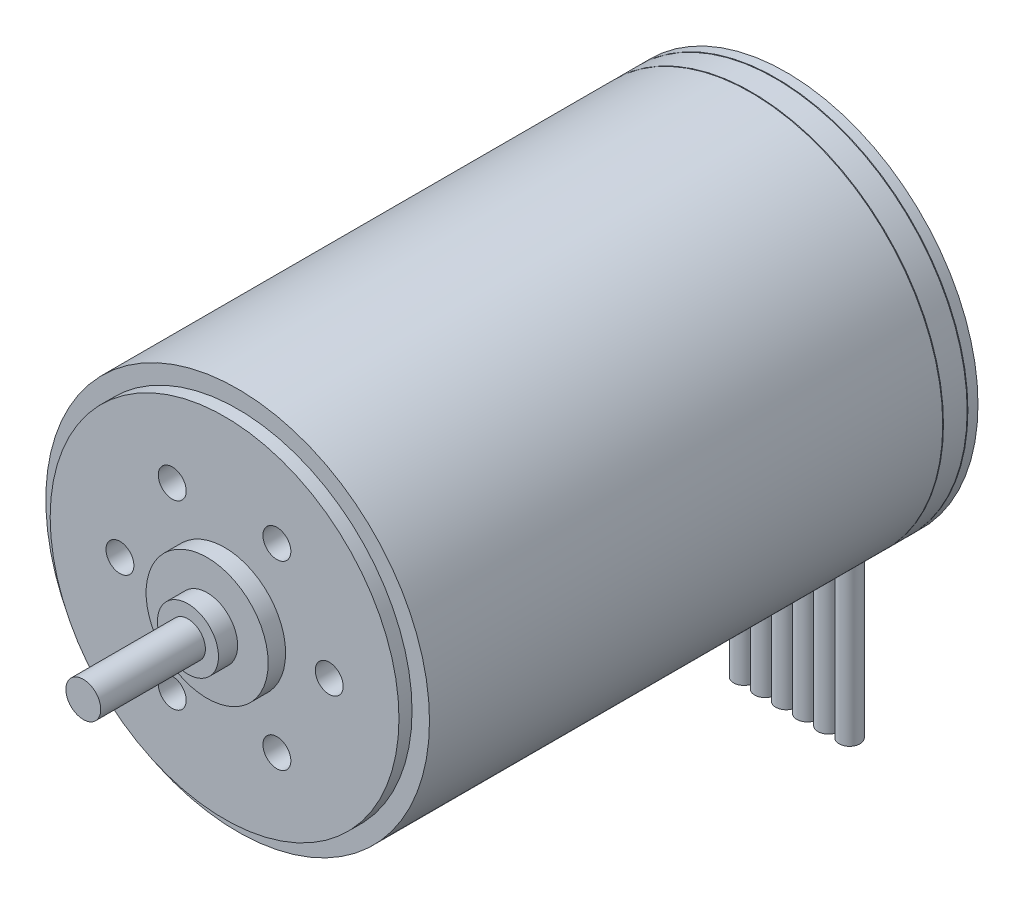
ISO-10303-21;
HEADER;
FILE_DESCRIPTION(('STEP AP214'),'2;1');
FILE_NAME('part.step','',(''),(''),'','','');
FILE_SCHEMA(('AUTOMOTIVE_DESIGN { 1 0 10303 214 1 1 1 1 }'));
ENDSEC;
DATA;
#1=APPLICATION_CONTEXT('core data for automotive mechanical design processes');
#2=APPLICATION_PROTOCOL_DEFINITION('international standard','automotive_design',2000,#1);
#3=PRODUCT_CONTEXT('',#1,'mechanical');
#4=PRODUCT('Part','Part','',(#3));
#5=PRODUCT_RELATED_PRODUCT_CATEGORY('part','',(#4));
#6=PRODUCT_DEFINITION_FORMATION('','',#4);
#7=PRODUCT_DEFINITION_CONTEXT('part definition',#1,'design');
#8=PRODUCT_DEFINITION('design','',#6,#7);
#9=PRODUCT_DEFINITION_SHAPE('','',#8);
#10=(LENGTH_UNIT() NAMED_UNIT(*) SI_UNIT(.MILLI.,.METRE.));
#11=(NAMED_UNIT(*) PLANE_ANGLE_UNIT() SI_UNIT($,.RADIAN.));
#12=(NAMED_UNIT(*) SI_UNIT($,.STERADIAN.) SOLID_ANGLE_UNIT());
#13=UNCERTAINTY_MEASURE_WITH_UNIT(LENGTH_MEASURE(1.E-05),#10,'distance_accuracy_value','');
#14=(GEOMETRIC_REPRESENTATION_CONTEXT(3) GLOBAL_UNCERTAINTY_ASSIGNED_CONTEXT((#13)) GLOBAL_UNIT_ASSIGNED_CONTEXT((#10,
#11,#12)) REPRESENTATION_CONTEXT('',''));
#15=CARTESIAN_POINT('',(0.,0.,0.));
#16=DIRECTION('',(0.,0.,1.));
#17=DIRECTION('',(1.,0.,0.));
#18=AXIS2_PLACEMENT_3D('',#15,#16,#17);
#19=CARTESIAN_POINT('',(4.61302503786831,-5.85,-2.40000000000001));
#20=DIRECTION('',(0.,1.,0.));
#21=DIRECTION('',(0.,0.,1.));
#22=AXIS2_PLACEMENT_3D('',#19,#20,#21);
#23=PLANE('',#22);
#24=CARTESIAN_POINT('',(1.815,-5.85,-0.610000000000013));
#25=DIRECTION('',(0.,1.,0.));
#26=DIRECTION('',(0.,0.,1.));
#27=AXIS2_PLACEMENT_3D('',#24,#25,#26);
#28=CIRCLE('',#27,0.599999999999999);
#29=CARTESIAN_POINT('',(1.815,-5.85,-0.0100000000000133));
#30=VERTEX_POINT('',#29);
#31=EDGE_CURVE('E42',#30,#30,#28,.F.);
#32=ORIENTED_EDGE('',*,*,#31,.F.);
#33=EDGE_LOOP('',(#32));
#34=FACE_BOUND('',#33,.T.);
#35=CARTESIAN_POINT('',(-0.605,-5.85,-0.610000000000013));
#36=DIRECTION('',(0.,1.,0.));
#37=DIRECTION('',(0.,0.,1.));
#38=AXIS2_PLACEMENT_3D('',#35,#36,#37);
#39=CIRCLE('',#38,0.6);
#40=CARTESIAN_POINT('',(-0.605,-5.85,-0.010000000000013));
#41=VERTEX_POINT('',#40);
#42=EDGE_CURVE('E218',#41,#41,#39,.F.);
#43=ORIENTED_EDGE('',*,*,#42,.F.);
#44=EDGE_LOOP('',(#43));
#45=FACE_BOUND('',#44,.T.);
#46=CARTESIAN_POINT('',(-3.025,-5.85,-0.610000000000013));
#47=DIRECTION('',(0.,1.,0.));
#48=DIRECTION('',(0.,0.,1.));
#49=AXIS2_PLACEMENT_3D('',#46,#47,#48);
#50=CIRCLE('',#49,0.6);
#51=CARTESIAN_POINT('',(-3.025,-5.85,-0.0100000000000133));
#52=VERTEX_POINT('',#51);
#53=EDGE_CURVE('E175',#52,#52,#50,.F.);
#54=ORIENTED_EDGE('',*,*,#53,.F.);
#55=EDGE_LOOP('',(#54));
#56=FACE_BOUND('',#55,.T.);
#57=DIRECTION('',(-1.,0.,0.));
#58=VECTOR('',#57,1.);
#59=CARTESIAN_POINT('',(4.61302503786832,-5.85,0.));
#60=LINE('',#59,#58);
#61=CARTESIAN_POINT('',(4.61302503786832,-5.85,0.));
#62=VERTEX_POINT('',#61);
#63=CARTESIAN_POINT('',(-4.61302503786832,-5.85,0.));
#64=VERTEX_POINT('',#63);
#65=EDGE_CURVE('E84',#62,#64,#60,.T.);
#66=ORIENTED_EDGE('',*,*,#65,.T.);
#67=DIRECTION('',(0.,0.,1.));
#68=VECTOR('',#67,1.);
#69=CARTESIAN_POINT('',(-4.61302503786832,-5.85,-2.39999999999999));
#70=LINE('',#69,#68);
#71=CARTESIAN_POINT('',(-4.61302503786832,-5.85,-2.39999999999999));
#72=VERTEX_POINT('',#71);
#73=EDGE_CURVE('E86',#72,#64,#70,.T.);
#74=ORIENTED_EDGE('',*,*,#73,.F.);
#75=DIRECTION('',(-1.,0.,0.));
#76=VECTOR('',#75,1.);
#77=CARTESIAN_POINT('',(4.61302503786831,-5.85,-2.40000000000001));
#78=LINE('',#77,#76);
#79=CARTESIAN_POINT('',(4.61302503786831,-5.85,-2.40000000000001));
#80=VERTEX_POINT('',#79);
#81=EDGE_CURVE('E78',#80,#72,#78,.T.);
#82=ORIENTED_EDGE('',*,*,#81,.F.);
#83=DIRECTION('',(0.,0.,1.));
#84=VECTOR('',#83,1.);
#85=CARTESIAN_POINT('',(4.61302503786831,-5.85,-2.40000000000001));
#86=LINE('',#85,#84);
#87=EDGE_CURVE('E88',#80,#62,#86,.T.);
#88=ORIENTED_EDGE('',*,*,#87,.T.);
#89=EDGE_LOOP('',(#66,#74,#82,#88));
#90=FACE_BOUND('',#89,.T.);
#91=CARTESIAN_POINT('',(-1.815,-5.85,-0.610000000000013));
#92=DIRECTION('',(0.,1.,0.));
#93=DIRECTION('',(0.,0.,1.));
#94=AXIS2_PLACEMENT_3D('',#91,#92,#93);
#95=CIRCLE('',#94,0.599999999999999);
#96=CARTESIAN_POINT('',(-1.815,-5.85,-0.0100000000000137));
#97=VERTEX_POINT('',#96);
#98=EDGE_CURVE('E215',#97,#97,#95,.F.);
#99=ORIENTED_EDGE('',*,*,#98,.F.);
#100=EDGE_LOOP('',(#99));
#101=FACE_BOUND('',#100,.T.);
#102=CARTESIAN_POINT('',(0.605,-5.85,-0.610000000000013));
#103=DIRECTION('',(0.,1.,0.));
#104=DIRECTION('',(0.,0.,1.));
#105=AXIS2_PLACEMENT_3D('',#102,#103,#104);
#106=CIRCLE('',#105,0.6);
#107=CARTESIAN_POINT('',(0.605,-5.85,-0.0100000000000127));
#108=VERTEX_POINT('',#107);
#109=EDGE_CURVE('E221',#108,#108,#106,.F.);
#110=ORIENTED_EDGE('',*,*,#109,.F.);
#111=EDGE_LOOP('',(#110));
#112=FACE_BOUND('',#111,.T.);
#113=CARTESIAN_POINT('',(3.025,-5.85,-0.610000000000012));
#114=DIRECTION('',(0.,1.,0.));
#115=DIRECTION('',(0.,0.,1.));
#116=AXIS2_PLACEMENT_3D('',#113,#114,#115);
#117=CIRCLE('',#116,0.6);
#118=CARTESIAN_POINT('',(3.025,-5.85,-0.0100000000000121));
#119=VERTEX_POINT('',#118);
#120=EDGE_CURVE('E11',#119,#119,#117,.F.);
#121=ORIENTED_EDGE('',*,*,#120,.F.);
#122=EDGE_LOOP('',(#121));
#123=FACE_BOUND('',#122,.T.);
#124=ADVANCED_FACE('F34',(#34,#45,#56,#90,#101,#112,#123),#23,.F.);
#125=CARTESIAN_POINT('',(0.,11.,0.));
#126=DIRECTION('',(0.,0.,-1.));
#127=DIRECTION('',(-1.,0.,0.));
#128=AXIS2_PLACEMENT_3D('',#125,#126,#127);
#129=PLANE('',#128);
#130=CARTESIAN_POINT('',(0.,0.,0.));
#131=DIRECTION('',(0.,0.,1.));
#132=DIRECTION('',(1.,0.,0.));
#133=AXIS2_PLACEMENT_3D('',#130,#131,#132);
#134=CIRCLE('',#133,11.);
#135=CARTESIAN_POINT('',(11.,0.,0.));
#136=VERTEX_POINT('',#135);
#137=EDGE_CURVE('E205',#136,#136,#134,.T.);
#138=ORIENTED_EDGE('',*,*,#137,.F.);
#139=EDGE_LOOP('',(#138));
#140=FACE_BOUND('',#139,.T.);
#141=ORIENTED_EDGE('',*,*,#65,.F.);
#142=CARTESIAN_POINT('',(0.,0.,0.));
#143=DIRECTION('',(0.,0.,-1.));
#144=DIRECTION('',(-1.,0.,0.));
#145=AXIS2_PLACEMENT_3D('',#142,#143,#144);
#146=CIRCLE('',#145,7.45);
#147=EDGE_CURVE('E49',#64,#62,#146,.T.);
#148=ORIENTED_EDGE('',*,*,#147,.F.);
#149=EDGE_LOOP('',(#141,#148));
#150=FACE_BOUND('',#149,.T.);
#151=ADVANCED_FACE('F94',(#140,#150),#129,.T.);
#152=CARTESIAN_POINT('',(0.,0.,40.3));
#153=DIRECTION('',(0.,0.,1.));
#154=DIRECTION('',(1.,0.,0.));
#155=AXIS2_PLACEMENT_3D('',#152,#153,#154);
#156=PLANE('',#155);
#157=CARTESIAN_POINT('',(0.,0.,40.3));
#158=DIRECTION('',(0.,0.,1.));
#159=DIRECTION('',(1.,0.,0.));
#160=AXIS2_PLACEMENT_3D('',#157,#158,#159);
#161=CIRCLE('',#160,1.00000000000001);
#162=CARTESIAN_POINT('',(1.00000000000006,0.,40.3));
#163=VERTEX_POINT('',#162);
#164=EDGE_CURVE('E104',#163,#163,#161,.F.);
#165=ORIENTED_EDGE('',*,*,#164,.F.);
#166=EDGE_LOOP('',(#165));
#167=FACE_BOUND('',#166,.T.);
#168=ADVANCED_FACE('F36',(#167),#156,.T.);
#169=CARTESIAN_POINT('',(0.,0.,0.));
#170=DIRECTION('',(0.,0.,1.));
#171=DIRECTION('',(1.,0.,0.));
#172=AXIS2_PLACEMENT_3D('',#169,#170,#171);
#173=CYLINDRICAL_SURFACE('',#172,1.00000000000001);
#174=ORIENTED_EDGE('',*,*,#164,.T.);
#175=EDGE_LOOP('',(#174));
#176=FACE_BOUND('',#175,.T.);
#177=CARTESIAN_POINT('',(0.,0.,34.3));
#178=DIRECTION('',(0.,0.,1.));
#179=DIRECTION('',(1.,0.,0.));
#180=AXIS2_PLACEMENT_3D('',#177,#178,#179);
#181=CIRCLE('',#180,1.00000000000001);
#182=CARTESIAN_POINT('',(1.00000000000006,0.,34.3));
#183=VERTEX_POINT('',#182);
#184=EDGE_CURVE('E208',#183,#183,#181,.F.);
#185=ORIENTED_EDGE('',*,*,#184,.F.);
#186=EDGE_LOOP('',(#185));
#187=FACE_BOUND('',#186,.T.);
#188=ADVANCED_FACE('F355',(#176,#187),#173,.T.);
#189=CARTESIAN_POINT('',(0.,1.00000000000001,34.3));
#190=DIRECTION('',(0.,0.,1.));
#191=DIRECTION('',(1.,0.,0.));
#192=AXIS2_PLACEMENT_3D('',#189,#190,#191);
#193=PLANE('',#192);
#194=ORIENTED_EDGE('',*,*,#184,.T.);
#195=EDGE_LOOP('',(#194));
#196=FACE_BOUND('',#195,.T.);
#197=CARTESIAN_POINT('',(0.,0.,34.3));
#198=DIRECTION('',(0.,0.,1.));
#199=DIRECTION('',(1.,0.,0.));
#200=AXIS2_PLACEMENT_3D('',#197,#198,#199);
#201=CIRCLE('',#200,1.75000000000001);
#202=CARTESIAN_POINT('',(1.75000000000006,0.,34.3));
#203=VERTEX_POINT('',#202);
#204=EDGE_CURVE('E170',#203,#203,#201,.F.);
#205=ORIENTED_EDGE('',*,*,#204,.F.);
#206=EDGE_LOOP('',(#205));
#207=FACE_BOUND('',#206,.T.);
#208=ADVANCED_FACE('F351',(#196,#207),#193,.T.);
#209=CARTESIAN_POINT('',(0.,0.,0.));
#210=DIRECTION('',(0.,0.,1.));
#211=DIRECTION('',(1.,0.,0.));
#212=AXIS2_PLACEMENT_3D('',#209,#210,#211);
#213=CYLINDRICAL_SURFACE('',#212,11.);
#214=CARTESIAN_POINT('',(0.,0.,0.579289321814036));
#215=DIRECTION('',(0.,0.,-1.));
#216=DIRECTION('',(-1.,0.,0.));
#217=AXIS2_PLACEMENT_3D('',#214,#215,#216);
#218=CIRCLE('',#217,10.9999999999721);
#219=CARTESIAN_POINT('',(-10.9999999999721,0.,0.57928932181405));
#220=VERTEX_POINT('',#219);
#221=EDGE_CURVE('E167',#220,#220,#218,.F.);
#222=ORIENTED_EDGE('',*,*,#221,.F.);
#223=EDGE_LOOP('',(#222));
#224=FACE_BOUND('',#223,.T.);
#225=ORIENTED_EDGE('',*,*,#137,.T.);
#226=EDGE_LOOP('',(#225));
#227=FACE_BOUND('',#226,.T.);
#228=ADVANCED_FACE('F347',(#224,#227),#213,.T.);
#229=CARTESIAN_POINT('',(0.,0.,0.));
#230=DIRECTION('',(0.,0.,1.));
#231=DIRECTION('',(1.,0.,0.));
#232=AXIS2_PLACEMENT_3D('',#229,#230,#231);
#233=CYLINDRICAL_SURFACE('',#232,1.75000000000001);
#234=ORIENTED_EDGE('',*,*,#204,.T.);
#235=EDGE_LOOP('',(#234));
#236=FACE_BOUND('',#235,.T.);
#237=CARTESIAN_POINT('',(0.,0.,33.2));
#238=DIRECTION('',(0.,0.,1.));
#239=DIRECTION('',(1.,0.,0.));
#240=AXIS2_PLACEMENT_3D('',#237,#238,#239);
#241=CIRCLE('',#240,1.75000000000001);
#242=CARTESIAN_POINT('',(1.75000000000005,0.,33.2));
#243=VERTEX_POINT('',#242);
#244=EDGE_CURVE('E164',#243,#243,#241,.F.);
#245=ORIENTED_EDGE('',*,*,#244,.F.);
#246=EDGE_LOOP('',(#245));
#247=FACE_BOUND('',#246,.T.);
#248=ADVANCED_FACE('F343',(#236,#247),#233,.T.);
#249=CARTESIAN_POINT('',(0.,0.,0.579289321814036));
#250=DIRECTION('',(0.,0.,-1.));
#251=DIRECTION('',(-1.,0.,0.));
#252=AXIS2_PLACEMENT_3D('',#249,#250,#251);
#253=CONICAL_SURFACE('',#252,10.9999999999721,1.17809724374998);
#254=CARTESIAN_POINT('',(0.,0.,0.59999999993269));
#255=DIRECTION('',(0.,0.,1.));
#256=DIRECTION('',(1.,0.,0.));
#257=AXIS2_PLACEMENT_3D('',#254,#255,#256);
#258=CIRCLE('',#257,10.9500000000279);
#259=CARTESIAN_POINT('',(10.9500000000279,0.,0.599999999932676));
#260=VERTEX_POINT('',#259);
#261=EDGE_CURVE('E159',#260,#260,#258,.T.);
#262=ORIENTED_EDGE('',*,*,#261,.F.);
#263=EDGE_LOOP('',(#262));
#264=FACE_BOUND('',#263,.T.);
#265=ORIENTED_EDGE('',*,*,#221,.T.);
#266=EDGE_LOOP('',(#265));
#267=FACE_BOUND('',#266,.T.);
#268=ADVANCED_FACE('F340',(#264,#267),#253,.T.);
#269=CARTESIAN_POINT('',(-2.99999999999998,5.19615242270661,27.6999999999816));
#270=DIRECTION('',(0.,0.,1.));
#271=DIRECTION('',(1.,0.,0.));
#272=AXIS2_PLACEMENT_3D('',#269,#270,#271);
#273=CONICAL_SURFACE('',#272,0.80000000003064,1.02974425750488);
#274=CARTESIAN_POINT('',(-2.99999999992906,5.19615242262716,27.2193115035293));
#275=VERTEX_POINT('',#274);
#276=VERTEX_LOOP('',#275);
#277=FACE_BOUND('',#276,.T.);
#278=CARTESIAN_POINT('',(-2.99999999999998,5.19615242270661,27.7));
#279=DIRECTION('',(0.,0.,-1.));
#280=DIRECTION('',(0.,1.,0.));
#281=AXIS2_PLACEMENT_3D('',#278,#279,#280);
#282=CIRCLE('',#281,0.8);
#283=CARTESIAN_POINT('',(-2.99999999999998,5.99615242270661,27.7));
#284=VERTEX_POINT('',#283);
#285=EDGE_CURVE('E154',#284,#284,#282,.F.);
#286=ORIENTED_EDGE('',*,*,#285,.T.);
#287=EDGE_LOOP('',(#286));
#288=FACE_BOUND('',#287,.T.);
#289=ADVANCED_FACE('F336',(#277,#288),#273,.F.);
#290=CARTESIAN_POINT('',(2.99999999999998,5.1961524227066,27.6999999998679));
#291=DIRECTION('',(0.,0.,1.));
#292=DIRECTION('',(1.,0.,0.));
#293=AXIS2_PLACEMENT_3D('',#290,#291,#292);
#294=CONICAL_SURFACE('',#293,0.799999999903754,1.029744257343);
#295=CARTESIAN_POINT('',(3.00000000004275,5.19615242274085,27.2193115034156));
#296=VERTEX_POINT('',#295);
#297=VERTEX_LOOP('',#296);
#298=FACE_BOUND('',#297,.T.);
#299=CARTESIAN_POINT('',(2.99999999999998,5.19615242270661,27.7));
#300=DIRECTION('',(0.,0.,-1.));
#301=DIRECTION('',(0.,1.,0.));
#302=AXIS2_PLACEMENT_3D('',#299,#300,#301);
#303=CIRCLE('',#302,0.8);
#304=CARTESIAN_POINT('',(2.99999999999998,5.99615242270661,27.7));
#305=VERTEX_POINT('',#304);
#306=EDGE_CURVE('E149',#305,#305,#303,.F.);
#307=ORIENTED_EDGE('',*,*,#306,.T.);
#308=EDGE_LOOP('',(#307));
#309=FACE_BOUND('',#308,.T.);
#310=ADVANCED_FACE('F332',(#298,#309),#294,.F.);
#311=CARTESIAN_POINT('',(5.99999999999997,0.,27.6999999998679));
#312=DIRECTION('',(0.,0.,1.));
#313=DIRECTION('',(0.,-1.,0.));
#314=AXIS2_PLACEMENT_3D('',#311,#312,#313);
#315=CONICAL_SURFACE('',#314,0.799999999770504,1.02974425722659);
#316=CARTESIAN_POINT('',(6.00000000014234,0.,27.2193115034156));
#317=VERTEX_POINT('',#316);
#318=VERTEX_LOOP('',#317);
#319=FACE_BOUND('',#318,.T.);
#320=CARTESIAN_POINT('',(5.99999999999997,0.,27.7));
#321=DIRECTION('',(0.,0.,-1.));
#322=DIRECTION('',(-1.,0.,0.));
#323=AXIS2_PLACEMENT_3D('',#320,#321,#322);
#324=CIRCLE('',#323,0.8);
#325=CARTESIAN_POINT('',(5.19999999999997,0.,27.7));
#326=VERTEX_POINT('',#325);
#327=EDGE_CURVE('E144',#326,#326,#324,.F.);
#328=ORIENTED_EDGE('',*,*,#327,.T.);
#329=EDGE_LOOP('',(#328));
#330=FACE_BOUND('',#329,.T.);
#331=ADVANCED_FACE('F328',(#319,#330),#315,.F.);
#332=CARTESIAN_POINT('',(2.99999999999998,-5.1961524227066,27.6999999999248));
#333=DIRECTION('',(0.,0.,1.));
#334=DIRECTION('',(1.,0.,0.));
#335=AXIS2_PLACEMENT_3D('',#332,#333,#334);
#336=CONICAL_SURFACE('',#335,0.799999999903754,1.02974425750131);
#337=CARTESIAN_POINT('',(2.9999999999859,-5.19615242262716,27.2193115035293));
#338=VERTEX_POINT('',#337);
#339=VERTEX_LOOP('',#338);
#340=FACE_BOUND('',#339,.T.);
#341=CARTESIAN_POINT('',(2.99999999999998,-5.19615242270661,27.7));
#342=DIRECTION('',(0.,0.,-1.));
#343=DIRECTION('',(0.,1.,0.));
#344=AXIS2_PLACEMENT_3D('',#341,#342,#343);
#345=CIRCLE('',#344,0.8);
#346=CARTESIAN_POINT('',(2.99999999999998,-4.39615242270661,27.7));
#347=VERTEX_POINT('',#346);
#348=EDGE_CURVE('E139',#347,#347,#345,.F.);
#349=ORIENTED_EDGE('',*,*,#348,.T.);
#350=EDGE_LOOP('',(#349));
#351=FACE_BOUND('',#350,.T.);
#352=ADVANCED_FACE('F324',(#340,#351),#336,.F.);
#353=CARTESIAN_POINT('',(-2.99999999999998,-5.1961524227066,27.6999999999248));
#354=DIRECTION('',(0.,0.,1.));
#355=DIRECTION('',(1.,0.,0.));
#356=AXIS2_PLACEMENT_3D('',#353,#354,#355);
#357=CONICAL_SURFACE('',#356,0.799999999903754,1.02974425736693);
#358=CARTESIAN_POINT('',(-3.00000000009959,-5.1961524227977,27.2193115034156));
#359=VERTEX_POINT('',#358);
#360=VERTEX_LOOP('',#359);
#361=FACE_BOUND('',#360,.T.);
#362=CARTESIAN_POINT('',(-2.99999999999998,-5.19615242270661,27.7));
#363=DIRECTION('',(0.,0.,-1.));
#364=DIRECTION('',(0.,1.,0.));
#365=AXIS2_PLACEMENT_3D('',#362,#363,#364);
#366=CIRCLE('',#365,0.8);
#367=CARTESIAN_POINT('',(-2.99999999999998,-4.39615242270661,27.7));
#368=VERTEX_POINT('',#367);
#369=EDGE_CURVE('E134',#368,#368,#366,.F.);
#370=ORIENTED_EDGE('',*,*,#369,.T.);
#371=EDGE_LOOP('',(#370));
#372=FACE_BOUND('',#371,.T.);
#373=ADVANCED_FACE('F321',(#361,#372),#357,.F.);
#374=CARTESIAN_POINT('',(-5.99999999999997,0.,27.6999999998679));
#375=DIRECTION('',(0.,0.,1.));
#376=DIRECTION('',(0.,-1.,0.));
#377=AXIS2_PLACEMENT_3D('',#374,#375,#376);
#378=CONICAL_SURFACE('',#377,0.799999999770504,1.02974425722659);
#379=CARTESIAN_POINT('',(-6.00000000014234,0.,27.2193115034156));
#380=VERTEX_POINT('',#379);
#381=VERTEX_LOOP('',#380);
#382=FACE_BOUND('',#381,.T.);
#383=CARTESIAN_POINT('',(-5.99999999999997,0.,27.7));
#384=DIRECTION('',(0.,0.,-1.));
#385=DIRECTION('',(-1.,0.,0.));
#386=AXIS2_PLACEMENT_3D('',#383,#384,#385);
#387=CIRCLE('',#386,0.8);
#388=CARTESIAN_POINT('',(-6.79999999999997,0.,27.7));
#389=VERTEX_POINT('',#388);
#390=EDGE_CURVE('E131',#389,#389,#387,.F.);
#391=ORIENTED_EDGE('',*,*,#390,.T.);
#392=EDGE_LOOP('',(#391));
#393=FACE_BOUND('',#392,.T.);
#394=ADVANCED_FACE('F317',(#382,#393),#378,.F.);
#395=CARTESIAN_POINT('',(0.,1.75000000000001,33.2));
#396=DIRECTION('',(0.,0.,1.));
#397=DIRECTION('',(1.,0.,0.));
#398=AXIS2_PLACEMENT_3D('',#395,#396,#397);
#399=PLANE('',#398);
#400=ORIENTED_EDGE('',*,*,#244,.T.);
#401=EDGE_LOOP('',(#400));
#402=FACE_BOUND('',#401,.T.);
#403=CARTESIAN_POINT('',(0.,0.,33.2));
#404=DIRECTION('',(0.,0.,1.));
#405=DIRECTION('',(1.,0.,0.));
#406=AXIS2_PLACEMENT_3D('',#403,#404,#405);
#407=CIRCLE('',#406,3.50000000000001);
#408=CARTESIAN_POINT('',(3.50000000000006,0.,33.2));
#409=VERTEX_POINT('',#408);
#410=EDGE_CURVE('E128',#409,#409,#407,.F.);
#411=ORIENTED_EDGE('',*,*,#410,.F.);
#412=EDGE_LOOP('',(#411));
#413=FACE_BOUND('',#412,.T.);
#414=ADVANCED_FACE('F313',(#402,#413),#399,.T.);
#415=CARTESIAN_POINT('',(0.,0.,0.620710678118654));
#416=DIRECTION('',(0.,0.,1.));
#417=DIRECTION('',(1.,0.,0.));
#418=AXIS2_PLACEMENT_3D('',#415,#416,#417);
#419=CONICAL_SURFACE('',#418,11.,1.17809724374999);
#420=CARTESIAN_POINT('',(0.,0.,0.620710678118655));
#421=DIRECTION('',(0.,0.,1.));
#422=DIRECTION('',(1.,0.,0.));
#423=AXIS2_PLACEMENT_3D('',#420,#421,#422);
#424=CIRCLE('',#423,11.);
#425=CARTESIAN_POINT('',(11.,0.,0.62071067811864));
#426=VERTEX_POINT('',#425);
#427=EDGE_CURVE('E124',#426,#426,#424,.T.);
#428=ORIENTED_EDGE('',*,*,#427,.F.);
#429=EDGE_LOOP('',(#428));
#430=FACE_BOUND('',#429,.T.);
#431=ORIENTED_EDGE('',*,*,#261,.T.);
#432=EDGE_LOOP('',(#431));
#433=FACE_BOUND('',#432,.T.);
#434=ADVANCED_FACE('F309',(#430,#433),#419,.T.);
#435=CARTESIAN_POINT('',(-2.99999999999998,5.1961524227066,32.2));
#436=DIRECTION('',(0.,0.,-1.));
#437=DIRECTION('',(0.,1.,0.));
#438=AXIS2_PLACEMENT_3D('',#435,#436,#437);
#439=CYLINDRICAL_SURFACE('',#438,0.8);
#440=CARTESIAN_POINT('',(-2.99999999999998,5.1961524227066,32.2));
#441=DIRECTION('',(0.,0.,-1.));
#442=DIRECTION('',(0.,1.,0.));
#443=AXIS2_PLACEMENT_3D('',#440,#441,#442);
#444=CIRCLE('',#443,0.8);
#445=CARTESIAN_POINT('',(-2.99999999999998,5.9961524227066,32.2));
#446=VERTEX_POINT('',#445);
#447=EDGE_CURVE('E127',#446,#446,#444,.T.);
#448=ORIENTED_EDGE('',*,*,#447,.F.);
#449=EDGE_LOOP('',(#448));
#450=FACE_BOUND('',#449,.T.);
#451=ORIENTED_EDGE('',*,*,#285,.F.);
#452=EDGE_LOOP('',(#451));
#453=FACE_BOUND('',#452,.T.);
#454=ADVANCED_FACE('F305',(#450,#453),#439,.F.);
#455=CARTESIAN_POINT('',(2.99999999999998,5.1961524227066,32.2));
#456=DIRECTION('',(0.,0.,-1.));
#457=DIRECTION('',(0.,1.,0.));
#458=AXIS2_PLACEMENT_3D('',#455,#456,#457);
#459=CYLINDRICAL_SURFACE('',#458,0.8);
#460=CARTESIAN_POINT('',(2.99999999999998,5.1961524227066,32.2));
#461=DIRECTION('',(0.,0.,-1.));
#462=DIRECTION('',(0.,1.,0.));
#463=AXIS2_PLACEMENT_3D('',#460,#461,#462);
#464=CIRCLE('',#463,0.8);
#465=CARTESIAN_POINT('',(2.99999999999998,5.9961524227066,32.2));
#466=VERTEX_POINT('',#465);
#467=EDGE_CURVE('E194',#466,#466,#464,.T.);
#468=ORIENTED_EDGE('',*,*,#467,.F.);
#469=EDGE_LOOP('',(#468));
#470=FACE_BOUND('',#469,.T.);
#471=ORIENTED_EDGE('',*,*,#306,.F.);
#472=EDGE_LOOP('',(#471));
#473=FACE_BOUND('',#472,.T.);
#474=ADVANCED_FACE('F301',(#470,#473),#459,.F.);
#475=CARTESIAN_POINT('',(5.99999999999996,0.,32.2));
#476=DIRECTION('',(0.,0.,-1.));
#477=DIRECTION('',(-1.,0.,0.));
#478=AXIS2_PLACEMENT_3D('',#475,#476,#477);
#479=CYLINDRICAL_SURFACE('',#478,0.8);
#480=CARTESIAN_POINT('',(5.99999999999996,0.,32.2));
#481=DIRECTION('',(0.,0.,-1.));
#482=DIRECTION('',(-1.,0.,0.));
#483=AXIS2_PLACEMENT_3D('',#480,#481,#482);
#484=CIRCLE('',#483,0.8);
#485=CARTESIAN_POINT('',(5.19999999999996,0.,32.2));
#486=VERTEX_POINT('',#485);
#487=EDGE_CURVE('E191',#486,#486,#484,.T.);
#488=ORIENTED_EDGE('',*,*,#487,.F.);
#489=EDGE_LOOP('',(#488));
#490=FACE_BOUND('',#489,.T.);
#491=ORIENTED_EDGE('',*,*,#327,.F.);
#492=EDGE_LOOP('',(#491));
#493=FACE_BOUND('',#492,.T.);
#494=ADVANCED_FACE('F297',(#490,#493),#479,.F.);
#495=CARTESIAN_POINT('',(2.99999999999998,-5.1961524227066,32.2));
#496=DIRECTION('',(0.,0.,-1.));
#497=DIRECTION('',(0.,1.,0.));
#498=AXIS2_PLACEMENT_3D('',#495,#496,#497);
#499=CYLINDRICAL_SURFACE('',#498,0.8);
#500=CARTESIAN_POINT('',(2.99999999999998,-5.1961524227066,32.2));
#501=DIRECTION('',(0.,0.,-1.));
#502=DIRECTION('',(0.,1.,0.));
#503=AXIS2_PLACEMENT_3D('',#500,#501,#502);
#504=CIRCLE('',#503,0.8);
#505=CARTESIAN_POINT('',(2.99999999999998,-4.3961524227066,32.2));
#506=VERTEX_POINT('',#505);
#507=EDGE_CURVE('E188',#506,#506,#504,.T.);
#508=ORIENTED_EDGE('',*,*,#507,.F.);
#509=EDGE_LOOP('',(#508));
#510=FACE_BOUND('',#509,.T.);
#511=ORIENTED_EDGE('',*,*,#348,.F.);
#512=EDGE_LOOP('',(#511));
#513=FACE_BOUND('',#512,.T.);
#514=ADVANCED_FACE('F293',(#510,#513),#499,.F.);
#515=CARTESIAN_POINT('',(-2.99999999999998,-5.1961524227066,32.2));
#516=DIRECTION('',(0.,0.,-1.));
#517=DIRECTION('',(0.,1.,0.));
#518=AXIS2_PLACEMENT_3D('',#515,#516,#517);
#519=CYLINDRICAL_SURFACE('',#518,0.8);
#520=CARTESIAN_POINT('',(-2.99999999999998,-5.1961524227066,32.2));
#521=DIRECTION('',(0.,0.,-1.));
#522=DIRECTION('',(0.,1.,0.));
#523=AXIS2_PLACEMENT_3D('',#520,#521,#522);
#524=CIRCLE('',#523,0.8);
#525=CARTESIAN_POINT('',(-2.99999999999998,-4.3961524227066,32.2));
#526=VERTEX_POINT('',#525);
#527=EDGE_CURVE('E185',#526,#526,#524,.T.);
#528=ORIENTED_EDGE('',*,*,#527,.F.);
#529=EDGE_LOOP('',(#528));
#530=FACE_BOUND('',#529,.T.);
#531=ORIENTED_EDGE('',*,*,#369,.F.);
#532=EDGE_LOOP('',(#531));
#533=FACE_BOUND('',#532,.T.);
#534=ADVANCED_FACE('F289',(#530,#533),#519,.F.);
#535=CARTESIAN_POINT('',(-5.99999999999996,0.,32.2));
#536=DIRECTION('',(0.,0.,-1.));
#537=DIRECTION('',(-1.,0.,0.));
#538=AXIS2_PLACEMENT_3D('',#535,#536,#537);
#539=CYLINDRICAL_SURFACE('',#538,0.8);
#540=CARTESIAN_POINT('',(-5.99999999999996,0.,32.2));
#541=DIRECTION('',(0.,0.,-1.));
#542=DIRECTION('',(-1.,0.,0.));
#543=AXIS2_PLACEMENT_3D('',#540,#541,#542);
#544=CIRCLE('',#543,0.8);
#545=CARTESIAN_POINT('',(-6.79999999999996,0.,32.2));
#546=VERTEX_POINT('',#545);
#547=EDGE_CURVE('E182',#546,#546,#544,.T.);
#548=ORIENTED_EDGE('',*,*,#547,.F.);
#549=EDGE_LOOP('',(#548));
#550=FACE_BOUND('',#549,.T.);
#551=ORIENTED_EDGE('',*,*,#390,.F.);
#552=EDGE_LOOP('',(#551));
#553=FACE_BOUND('',#552,.T.);
#554=ADVANCED_FACE('F285',(#550,#553),#539,.F.);
#555=CARTESIAN_POINT('',(0.,0.,0.));
#556=DIRECTION('',(0.,0.,1.));
#557=DIRECTION('',(1.,0.,0.));
#558=AXIS2_PLACEMENT_3D('',#555,#556,#557);
#559=CYLINDRICAL_SURFACE('',#558,3.50000000000001);
#560=ORIENTED_EDGE('',*,*,#410,.T.);
#561=EDGE_LOOP('',(#560));
#562=FACE_BOUND('',#561,.T.);
#563=CARTESIAN_POINT('',(0.,0.,32.2));
#564=DIRECTION('',(0.,0.,1.));
#565=DIRECTION('',(1.,0.,0.));
#566=AXIS2_PLACEMENT_3D('',#563,#564,#565);
#567=CIRCLE('',#566,3.50000000000001);
#568=CARTESIAN_POINT('',(3.50000000000005,0.,32.2));
#569=VERTEX_POINT('',#568);
#570=EDGE_CURVE('E121',#569,#569,#567,.F.);
#571=ORIENTED_EDGE('',*,*,#570,.F.);
#572=EDGE_LOOP('',(#571));
#573=FACE_BOUND('',#572,.T.);
#574=ADVANCED_FACE('F281',(#562,#573),#559,.T.);
#575=CARTESIAN_POINT('',(0.,0.,0.));
#576=DIRECTION('',(0.,0.,1.));
#577=DIRECTION('',(1.,0.,0.));
#578=AXIS2_PLACEMENT_3D('',#575,#576,#577);
#579=CYLINDRICAL_SURFACE('',#578,11.);
#580=CARTESIAN_POINT('',(0.,0.,1.97928932181404));
#581=DIRECTION('',(0.,0.,-1.));
#582=DIRECTION('',(-1.,0.,0.));
#583=AXIS2_PLACEMENT_3D('',#580,#581,#582);
#584=CIRCLE('',#583,10.9999999999721);
#585=CARTESIAN_POINT('',(-10.9999999999721,0.,1.97928932181405));
#586=VERTEX_POINT('',#585);
#587=EDGE_CURVE('E118',#586,#586,#584,.F.);
#588=ORIENTED_EDGE('',*,*,#587,.F.);
#589=EDGE_LOOP('',(#588));
#590=FACE_BOUND('',#589,.T.);
#591=ORIENTED_EDGE('',*,*,#427,.T.);
#592=EDGE_LOOP('',(#591));
#593=FACE_BOUND('',#592,.T.);
#594=ADVANCED_FACE('F277',(#590,#593),#579,.T.);
#595=CARTESIAN_POINT('',(0.,3.50000000000001,32.2));
#596=DIRECTION('',(0.,0.,1.));
#597=DIRECTION('',(1.,0.,0.));
#598=AXIS2_PLACEMENT_3D('',#595,#596,#597);
#599=PLANE('',#598);
#600=ORIENTED_EDGE('',*,*,#570,.T.);
#601=EDGE_LOOP('',(#600));
#602=FACE_BOUND('',#601,.T.);
#603=CARTESIAN_POINT('',(0.,0.,32.2));
#604=DIRECTION('',(0.,0.,1.));
#605=DIRECTION('',(1.,0.,0.));
#606=AXIS2_PLACEMENT_3D('',#603,#604,#605);
#607=CIRCLE('',#606,10.);
#608=CARTESIAN_POINT('',(10.,0.,32.2));
#609=VERTEX_POINT('',#608);
#610=EDGE_CURVE('E115',#609,#609,#607,.F.);
#611=ORIENTED_EDGE('',*,*,#610,.F.);
#612=EDGE_LOOP('',(#611));
#613=FACE_BOUND('',#612,.T.);
#614=ORIENTED_EDGE('',*,*,#547,.T.);
#615=EDGE_LOOP('',(#614));
#616=FACE_BOUND('',#615,.T.);
#617=ORIENTED_EDGE('',*,*,#527,.T.);
#618=EDGE_LOOP('',(#617));
#619=FACE_BOUND('',#618,.T.);
#620=ORIENTED_EDGE('',*,*,#507,.T.);
#621=EDGE_LOOP('',(#620));
#622=FACE_BOUND('',#621,.T.);
#623=ORIENTED_EDGE('',*,*,#487,.T.);
#624=EDGE_LOOP('',(#623));
#625=FACE_BOUND('',#624,.T.);
#626=ORIENTED_EDGE('',*,*,#467,.T.);
#627=EDGE_LOOP('',(#626));
#628=FACE_BOUND('',#627,.T.);
#629=ORIENTED_EDGE('',*,*,#447,.T.);
#630=EDGE_LOOP('',(#629));
#631=FACE_BOUND('',#630,.T.);
#632=ADVANCED_FACE('F273',(#602,#613,#616,#619,#622,#625,#628,#631),#599,.T.);
#633=CARTESIAN_POINT('',(0.,0.,1.97928932181404));
#634=DIRECTION('',(0.,0.,-1.));
#635=DIRECTION('',(-1.,0.,0.));
#636=AXIS2_PLACEMENT_3D('',#633,#634,#635);
#637=CONICAL_SURFACE('',#636,10.9999999999721,1.17809724375);
#638=CARTESIAN_POINT('',(0.,0.,1.99999999993268));
#639=DIRECTION('',(0.,0.,1.));
#640=DIRECTION('',(1.,0.,0.));
#641=AXIS2_PLACEMENT_3D('',#638,#639,#640);
#642=CIRCLE('',#641,10.9500000000279);
#643=CARTESIAN_POINT('',(10.9500000000279,0.,1.99999999993267));
#644=VERTEX_POINT('',#643);
#645=EDGE_CURVE('E112',#644,#644,#642,.T.);
#646=ORIENTED_EDGE('',*,*,#645,.F.);
#647=EDGE_LOOP('',(#646));
#648=FACE_BOUND('',#647,.T.);
#649=ORIENTED_EDGE('',*,*,#587,.T.);
#650=EDGE_LOOP('',(#649));
#651=FACE_BOUND('',#650,.T.);
#652=ADVANCED_FACE('F269',(#648,#651),#637,.T.);
#653=CARTESIAN_POINT('',(0.,0.,0.));
#654=DIRECTION('',(0.,0.,1.));
#655=DIRECTION('',(1.,0.,0.));
#656=AXIS2_PLACEMENT_3D('',#653,#654,#655);
#657=CYLINDRICAL_SURFACE('',#656,10.);
#658=ORIENTED_EDGE('',*,*,#610,.T.);
#659=EDGE_LOOP('',(#658));
#660=FACE_BOUND('',#659,.T.);
#661=CARTESIAN_POINT('',(0.,0.,31.45));
#662=DIRECTION('',(0.,0.,1.));
#663=DIRECTION('',(1.,0.,0.));
#664=AXIS2_PLACEMENT_3D('',#661,#662,#663);
#665=CIRCLE('',#664,10.);
#666=CARTESIAN_POINT('',(10.,0.,31.45));
#667=VERTEX_POINT('',#666);
#668=EDGE_CURVE('E109',#667,#667,#665,.F.);
#669=ORIENTED_EDGE('',*,*,#668,.F.);
#670=EDGE_LOOP('',(#669));
#671=FACE_BOUND('',#670,.T.);
#672=ADVANCED_FACE('F265',(#660,#671),#657,.T.);
#673=CARTESIAN_POINT('',(0.,0.,2.02071067811865));
#674=DIRECTION('',(0.,0.,1.));
#675=DIRECTION('',(1.,0.,0.));
#676=AXIS2_PLACEMENT_3D('',#673,#674,#675);
#677=CONICAL_SURFACE('',#676,11.,1.17809724374999);
#678=CARTESIAN_POINT('',(0.,0.,2.02071067811865));
#679=DIRECTION('',(0.,0.,1.));
#680=DIRECTION('',(1.,0.,0.));
#681=AXIS2_PLACEMENT_3D('',#678,#679,#680);
#682=CIRCLE('',#681,11.);
#683=CARTESIAN_POINT('',(11.,0.,2.02071067811864));
#684=VERTEX_POINT('',#683);
#685=EDGE_CURVE('E105',#684,#684,#682,.T.);
#686=ORIENTED_EDGE('',*,*,#685,.F.);
#687=EDGE_LOOP('',(#686));
#688=FACE_BOUND('',#687,.T.);
#689=ORIENTED_EDGE('',*,*,#645,.T.);
#690=EDGE_LOOP('',(#689));
#691=FACE_BOUND('',#690,.T.);
#692=ADVANCED_FACE('F261',(#688,#691),#677,.T.);
#693=CARTESIAN_POINT('',(0.,10.,31.45));
#694=DIRECTION('',(0.,0.,1.));
#695=DIRECTION('',(1.,0.,0.));
#696=AXIS2_PLACEMENT_3D('',#693,#694,#695);
#697=PLANE('',#696);
#698=ORIENTED_EDGE('',*,*,#668,.T.);
#699=EDGE_LOOP('',(#698));
#700=FACE_BOUND('',#699,.T.);
#701=CARTESIAN_POINT('',(0.,0.,31.45));
#702=DIRECTION('',(0.,0.,1.));
#703=DIRECTION('',(1.,0.,0.));
#704=AXIS2_PLACEMENT_3D('',#701,#702,#703);
#705=CIRCLE('',#704,11.);
#706=CARTESIAN_POINT('',(11.,0.,31.45));
#707=VERTEX_POINT('',#706);
#708=EDGE_CURVE('E108',#707,#707,#705,.F.);
#709=ORIENTED_EDGE('',*,*,#708,.F.);
#710=EDGE_LOOP('',(#709));
#711=FACE_BOUND('',#710,.T.);
#712=ADVANCED_FACE('F257',(#700,#711),#697,.T.);
#713=CARTESIAN_POINT('',(0.,0.,0.));
#714=DIRECTION('',(0.,0.,1.));
#715=DIRECTION('',(1.,0.,0.));
#716=AXIS2_PLACEMENT_3D('',#713,#714,#715);
#717=CYLINDRICAL_SURFACE('',#716,11.);
#718=ORIENTED_EDGE('',*,*,#708,.T.);
#719=EDGE_LOOP('',(#718));
#720=FACE_BOUND('',#719,.T.);
#721=ORIENTED_EDGE('',*,*,#685,.T.);
#722=EDGE_LOOP('',(#721));
#723=FACE_BOUND('',#722,.T.);
#724=ADVANCED_FACE('F254',(#720,#723),#717,.T.);
#725=CARTESIAN_POINT('',(0.,0.,-2.4));
#726=DIRECTION('',(0.,0.,1.));
#727=DIRECTION('',(1.,0.,0.));
#728=AXIS2_PLACEMENT_3D('',#725,#726,#727);
#729=CYLINDRICAL_SURFACE('',#728,7.45);
#730=ORIENTED_EDGE('',*,*,#147,.T.);
#731=ORIENTED_EDGE('',*,*,#87,.F.);
#732=CARTESIAN_POINT('',(0.,0.,-2.4));
#733=DIRECTION('',(0.,0.,-1.));
#734=DIRECTION('',(-1.,0.,0.));
#735=AXIS2_PLACEMENT_3D('',#732,#733,#734);
#736=CIRCLE('',#735,7.45);
#737=EDGE_CURVE('E90',#72,#80,#736,.T.);
#738=ORIENTED_EDGE('',*,*,#737,.F.);
#739=ORIENTED_EDGE('',*,*,#73,.T.);
#740=EDGE_LOOP('',(#730,#731,#738,#739));
#741=FACE_BOUND('',#740,.T.);
#742=ADVANCED_FACE('F92',(#741),#729,.T.);
#743=CARTESIAN_POINT('',(0.,0.,-2.4));
#744=DIRECTION('',(0.,0.,-1.));
#745=DIRECTION('',(-1.,0.,0.));
#746=AXIS2_PLACEMENT_3D('',#743,#744,#745);
#747=PLANE('',#746);
#748=ORIENTED_EDGE('',*,*,#737,.T.);
#749=ORIENTED_EDGE('',*,*,#81,.T.);
#750=EDGE_LOOP('',(#748,#749));
#751=FACE_BOUND('',#750,.T.);
#752=ADVANCED_FACE('F238',(#751),#747,.T.);
#753=CARTESIAN_POINT('',(-3.025,-20.85,-0.610000000000013));
#754=DIRECTION('',(0.,1.,0.));
#755=DIRECTION('',(0.,0.,1.));
#756=AXIS2_PLACEMENT_3D('',#753,#754,#755);
#757=CYLINDRICAL_SURFACE('',#756,0.6);
#758=CARTESIAN_POINT('',(-3.025,-20.85,-0.610000000000013));
#759=DIRECTION('',(0.,-1.,0.));
#760=DIRECTION('',(0.,0.,-1.));
#761=AXIS2_PLACEMENT_3D('',#758,#759,#760);
#762=CIRCLE('',#761,0.6);
#763=CARTESIAN_POINT('',(-3.025,-20.85,-1.21000000000001));
#764=VERTEX_POINT('',#763);
#765=EDGE_CURVE('E95',#764,#764,#762,.T.);
#766=ORIENTED_EDGE('',*,*,#765,.F.);
#767=EDGE_LOOP('',(#766));
#768=FACE_BOUND('',#767,.T.);
#769=ORIENTED_EDGE('',*,*,#53,.T.);
#770=EDGE_LOOP('',(#769));
#771=FACE_BOUND('',#770,.T.);
#772=ADVANCED_FACE('F235',(#768,#771),#757,.T.);
#773=CARTESIAN_POINT('',(-3.025,-20.85,-0.610000000000013));
#774=DIRECTION('',(0.,-1.,0.));
#775=DIRECTION('',(0.,0.,-1.));
#776=AXIS2_PLACEMENT_3D('',#773,#774,#775);
#777=PLANE('',#776);
#778=ORIENTED_EDGE('',*,*,#765,.T.);
#779=EDGE_LOOP('',(#778));
#780=FACE_BOUND('',#779,.T.);
#781=ADVANCED_FACE('F237',(#780),#777,.T.);
#782=CARTESIAN_POINT('',(-1.815,-20.85,-0.610000000000013));
#783=DIRECTION('',(0.,1.,0.));
#784=DIRECTION('',(0.,0.,1.));
#785=AXIS2_PLACEMENT_3D('',#782,#783,#784);
#786=CYLINDRICAL_SURFACE('',#785,0.599999999999999);
#787=CARTESIAN_POINT('',(-1.815,-20.85,-0.610000000000013));
#788=DIRECTION('',(0.,-1.,0.));
#789=DIRECTION('',(0.,0.,-1.));
#790=AXIS2_PLACEMENT_3D('',#787,#788,#789);
#791=CIRCLE('',#790,0.599999999999999);
#792=CARTESIAN_POINT('',(-1.815,-20.85,-1.21000000000001));
#793=VERTEX_POINT('',#792);
#794=EDGE_CURVE('E98',#793,#793,#791,.T.);
#795=ORIENTED_EDGE('',*,*,#794,.F.);
#796=EDGE_LOOP('',(#795));
#797=FACE_BOUND('',#796,.T.);
#798=ORIENTED_EDGE('',*,*,#98,.T.);
#799=EDGE_LOOP('',(#798));
#800=FACE_BOUND('',#799,.T.);
#801=ADVANCED_FACE('F245',(#797,#800),#786,.T.);
#802=CARTESIAN_POINT('',(-1.815,-20.85,-0.610000000000013));
#803=DIRECTION('',(0.,-1.,0.));
#804=DIRECTION('',(0.,0.,-1.));
#805=AXIS2_PLACEMENT_3D('',#802,#803,#804);
#806=PLANE('',#805);
#807=ORIENTED_EDGE('',*,*,#794,.T.);
#808=EDGE_LOOP('',(#807));
#809=FACE_BOUND('',#808,.T.);
#810=ADVANCED_FACE('F461',(#809),#806,.T.);
#811=CARTESIAN_POINT('',(-0.605,-20.85,-0.610000000000013));
#812=DIRECTION('',(0.,1.,0.));
#813=DIRECTION('',(0.,0.,1.));
#814=AXIS2_PLACEMENT_3D('',#811,#812,#813);
#815=CYLINDRICAL_SURFACE('',#814,0.6);
#816=CARTESIAN_POINT('',(-0.605,-20.85,-0.610000000000013));
#817=DIRECTION('',(0.,-1.,0.));
#818=DIRECTION('',(0.,0.,-1.));
#819=AXIS2_PLACEMENT_3D('',#816,#817,#818);
#820=CIRCLE('',#819,0.6);
#821=CARTESIAN_POINT('',(-0.605,-20.85,-1.21000000000001));
#822=VERTEX_POINT('',#821);
#823=EDGE_CURVE('E564',#822,#822,#820,.T.);
#824=ORIENTED_EDGE('',*,*,#823,.F.);
#825=EDGE_LOOP('',(#824));
#826=FACE_BOUND('',#825,.T.);
#827=ORIENTED_EDGE('',*,*,#42,.T.);
#828=EDGE_LOOP('',(#827));
#829=FACE_BOUND('',#828,.T.);
#830=ADVANCED_FACE('F470',(#826,#829),#815,.T.);
#831=CARTESIAN_POINT('',(-0.605,-20.85,-0.610000000000013));
#832=DIRECTION('',(0.,-1.,0.));
#833=DIRECTION('',(0.,0.,-1.));
#834=AXIS2_PLACEMENT_3D('',#831,#832,#833);
#835=PLANE('',#834);
#836=ORIENTED_EDGE('',*,*,#823,.T.);
#837=EDGE_LOOP('',(#836));
#838=FACE_BOUND('',#837,.T.);
#839=ADVANCED_FACE('F480',(#838),#835,.T.);
#840=CARTESIAN_POINT('',(0.605,-20.85,-0.610000000000013));
#841=DIRECTION('',(0.,1.,0.));
#842=DIRECTION('',(0.,0.,1.));
#843=AXIS2_PLACEMENT_3D('',#840,#841,#842);
#844=CYLINDRICAL_SURFACE('',#843,0.6);
#845=CARTESIAN_POINT('',(0.605,-20.85,-0.610000000000013));
#846=DIRECTION('',(0.,-1.,0.));
#847=DIRECTION('',(0.,0.,-1.));
#848=AXIS2_PLACEMENT_3D('',#845,#846,#847);
#849=CIRCLE('',#848,0.6);
#850=CARTESIAN_POINT('',(0.605,-20.85,-1.21000000000001));
#851=VERTEX_POINT('',#850);
#852=EDGE_CURVE('E559',#851,#851,#849,.T.);
#853=ORIENTED_EDGE('',*,*,#852,.F.);
#854=EDGE_LOOP('',(#853));
#855=FACE_BOUND('',#854,.T.);
#856=ORIENTED_EDGE('',*,*,#109,.T.);
#857=EDGE_LOOP('',(#856));
#858=FACE_BOUND('',#857,.T.);
#859=ADVANCED_FACE('F490',(#855,#858),#844,.T.);
#860=CARTESIAN_POINT('',(0.605,-20.85,-0.610000000000013));
#861=DIRECTION('',(0.,-1.,0.));
#862=DIRECTION('',(0.,0.,-1.));
#863=AXIS2_PLACEMENT_3D('',#860,#861,#862);
#864=PLANE('',#863);
#865=ORIENTED_EDGE('',*,*,#852,.T.);
#866=EDGE_LOOP('',(#865));
#867=FACE_BOUND('',#866,.T.);
#868=ADVANCED_FACE('F500',(#867),#864,.T.);
#869=CARTESIAN_POINT('',(1.815,-20.85,-0.610000000000013));
#870=DIRECTION('',(0.,1.,0.));
#871=DIRECTION('',(0.,0.,1.));
#872=AXIS2_PLACEMENT_3D('',#869,#870,#871);
#873=CYLINDRICAL_SURFACE('',#872,0.599999999999999);
#874=CARTESIAN_POINT('',(1.815,-20.85,-0.610000000000013));
#875=DIRECTION('',(0.,-1.,0.));
#876=DIRECTION('',(0.,0.,-1.));
#877=AXIS2_PLACEMENT_3D('',#874,#875,#876);
#878=CIRCLE('',#877,0.599999999999999);
#879=CARTESIAN_POINT('',(1.815,-20.85,-1.21000000000001));
#880=VERTEX_POINT('',#879);
#881=EDGE_CURVE('E556',#880,#880,#878,.T.);
#882=ORIENTED_EDGE('',*,*,#881,.F.);
#883=EDGE_LOOP('',(#882));
#884=FACE_BOUND('',#883,.T.);
#885=ORIENTED_EDGE('',*,*,#31,.T.);
#886=EDGE_LOOP('',(#885));
#887=FACE_BOUND('',#886,.T.);
#888=ADVANCED_FACE('F226',(#884,#887),#873,.T.);
#889=CARTESIAN_POINT('',(1.815,-20.85,-0.610000000000013));
#890=DIRECTION('',(0.,-1.,0.));
#891=DIRECTION('',(0.,0.,-1.));
#892=AXIS2_PLACEMENT_3D('',#889,#890,#891);
#893=PLANE('',#892);
#894=ORIENTED_EDGE('',*,*,#881,.T.);
#895=EDGE_LOOP('',(#894));
#896=FACE_BOUND('',#895,.T.);
#897=ADVANCED_FACE('F519',(#896),#893,.T.);
#898=CARTESIAN_POINT('',(3.025,-20.85,-0.610000000000012));
#899=DIRECTION('',(0.,1.,0.));
#900=DIRECTION('',(0.,0.,1.));
#901=AXIS2_PLACEMENT_3D('',#898,#899,#900);
#902=CYLINDRICAL_SURFACE('',#901,0.6);
#903=CARTESIAN_POINT('',(3.025,-20.85,-0.610000000000012));
#904=DIRECTION('',(0.,-1.,0.));
#905=DIRECTION('',(0.,0.,-1.));
#906=AXIS2_PLACEMENT_3D('',#903,#904,#905);
#907=CIRCLE('',#906,0.6);
#908=CARTESIAN_POINT('',(3.025,-20.85,-1.21000000000001));
#909=VERTEX_POINT('',#908);
#910=EDGE_CURVE('E555',#909,#909,#907,.T.);
#911=ORIENTED_EDGE('',*,*,#910,.F.);
#912=EDGE_LOOP('',(#911));
#913=FACE_BOUND('',#912,.T.);
#914=ORIENTED_EDGE('',*,*,#120,.T.);
#915=EDGE_LOOP('',(#914));
#916=FACE_BOUND('',#915,.T.);
#917=ADVANCED_FACE('F529',(#913,#916),#902,.T.);
#918=CARTESIAN_POINT('',(3.025,-20.85,-0.610000000000012));
#919=DIRECTION('',(0.,-1.,0.));
#920=DIRECTION('',(0.,0.,-1.));
#921=AXIS2_PLACEMENT_3D('',#918,#919,#920);
#922=PLANE('',#921);
#923=ORIENTED_EDGE('',*,*,#910,.T.);
#924=EDGE_LOOP('',(#923));
#925=FACE_BOUND('',#924,.T.);
#926=ADVANCED_FACE('F539',(#925),#922,.T.);
#927=CLOSED_SHELL('',(#124,#151,#168,#188,#208,#228,#248,#268,#289,#310,#331,#352,#373,#394,
#414,#434,#454,#474,#494,#514,#534,#554,#574,#594,#632,#652,#672,#692,#712,#724,#742,#752,#772,
#781,#801,#810,#830,#839,#859,#868,#888,#897,#917,#926));
#928=MANIFOLD_SOLID_BREP('B2',#927);
#929=ADVANCED_BREP_SHAPE_REPRESENTATION('',(#18,#928),#14);
#930=SHAPE_DEFINITION_REPRESENTATION(#9,#929);
ENDSEC;
END-ISO-10303-21;
